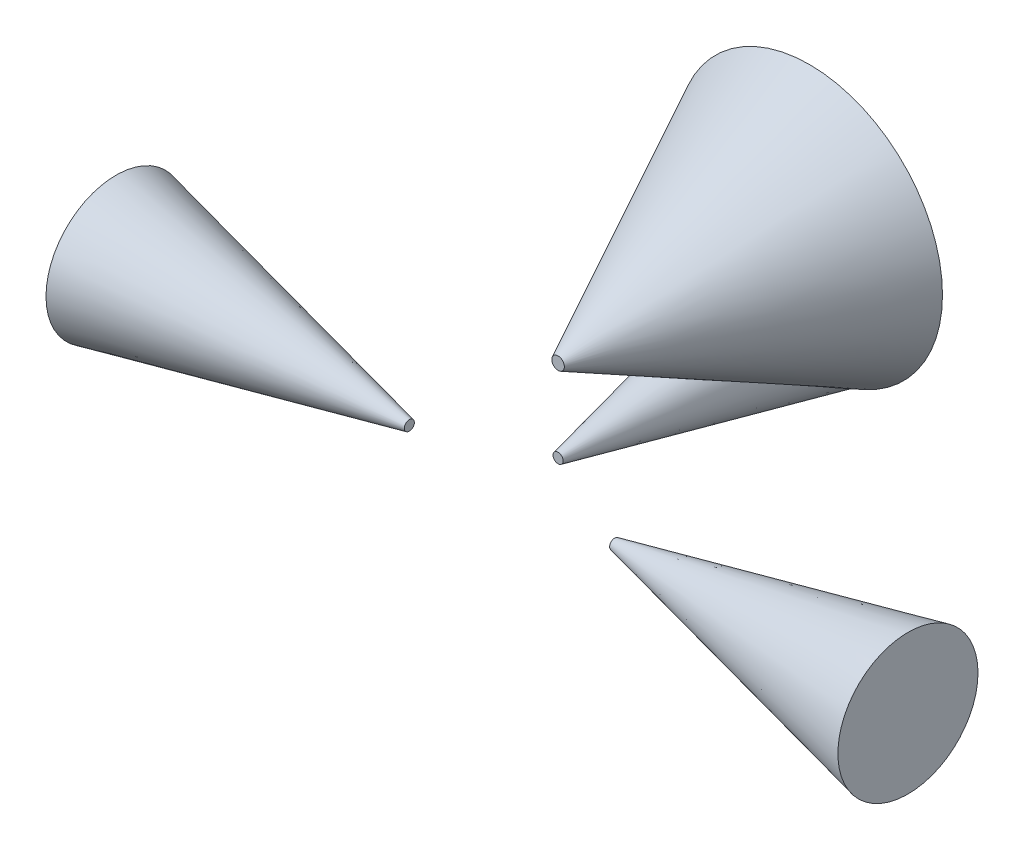
ISO-10303-21;
HEADER;
FILE_DESCRIPTION(('STEP AP214'),'2;1');
FILE_NAME('part.step','',(''),(''),'','','');
FILE_SCHEMA(('AUTOMOTIVE_DESIGN { 1 0 10303 214 1 1 1 1 }'));
ENDSEC;
DATA;
#1=APPLICATION_CONTEXT('core data for automotive mechanical design processes');
#2=APPLICATION_PROTOCOL_DEFINITION('international standard','automotive_design',2000,#1);
#3=PRODUCT_CONTEXT('',#1,'mechanical');
#4=PRODUCT('Part','Part','',(#3));
#5=PRODUCT_RELATED_PRODUCT_CATEGORY('part','',(#4));
#6=PRODUCT_DEFINITION_FORMATION('','',#4);
#7=PRODUCT_DEFINITION_CONTEXT('part definition',#1,'design');
#8=PRODUCT_DEFINITION('design','',#6,#7);
#9=PRODUCT_DEFINITION_SHAPE('','',#8);
#10=(LENGTH_UNIT() NAMED_UNIT(*) SI_UNIT(.MILLI.,.METRE.));
#11=(NAMED_UNIT(*) PLANE_ANGLE_UNIT() SI_UNIT($,.RADIAN.));
#12=(NAMED_UNIT(*) SI_UNIT($,.STERADIAN.) SOLID_ANGLE_UNIT());
#13=UNCERTAINTY_MEASURE_WITH_UNIT(LENGTH_MEASURE(1.E-05),#10,'distance_accuracy_value','');
#14=(GEOMETRIC_REPRESENTATION_CONTEXT(3) GLOBAL_UNCERTAINTY_ASSIGNED_CONTEXT((#13)) GLOBAL_UNIT_ASSIGNED_CONTEXT((#10,
#11,#12)) REPRESENTATION_CONTEXT('',''));
#15=CARTESIAN_POINT('',(0.,0.,0.));
#16=DIRECTION('',(0.,0.,1.));
#17=DIRECTION('',(1.,0.,0.));
#18=AXIS2_PLACEMENT_3D('',#15,#16,#17);
#19=CARTESIAN_POINT('',(0.,28.6,-43.));
#20=DIRECTION('',(0.,0.,-1.));
#21=DIRECTION('',(-1.,0.,0.));
#22=AXIS2_PLACEMENT_3D('',#19,#20,#21);
#23=CONICAL_SURFACE('',#22,1.5,0.466875574908483);
#24=CARTESIAN_POINT('',(0.,28.6,-103.));
#25=DIRECTION('',(0.,0.,-1.));
#26=DIRECTION('',(-1.,0.,0.));
#27=AXIS2_PLACEMENT_3D('',#24,#25,#26);
#28=CIRCLE('',#27,31.7424896594816);
#29=CARTESIAN_POINT('',(-31.7424896594816,28.6,-103.));
#30=VERTEX_POINT('',#29);
#31=EDGE_CURVE('E11',#30,#30,#28,.T.);
#32=CARTESIAN_POINT('',(0.,28.6,-43.));
#33=DIRECTION('',(0.,0.,-1.));
#34=DIRECTION('',(-1.,0.,0.));
#35=AXIS2_PLACEMENT_3D('',#32,#33,#34);
#36=CIRCLE('',#35,1.5);
#37=CARTESIAN_POINT('',(-1.5,28.6,-43.));
#38=VERTEX_POINT('',#37);
#39=EDGE_CURVE('E54',#38,#38,#36,.T.);
#40=CARTESIAN_POINT('',(-31.7424896594816,28.6,-103.));
#41=CARTESIAN_POINT('',(-31.4274637255287,28.6,-102.375));
#42=CARTESIAN_POINT('',(-31.1124377915757,28.6,-101.75));
#43=CARTESIAN_POINT('',(-30.4823859236698,28.6,-100.5));
#44=CARTESIAN_POINT('',(-30.1673599897169,28.6,-99.875));
#45=CARTESIAN_POINT('',(-29.537308121811,28.6,-98.625));
#46=CARTESIAN_POINT('',(-29.2222821878581,28.6,-98.));
#47=CARTESIAN_POINT('',(-28.5922303199523,28.6,-96.75));
#48=CARTESIAN_POINT('',(-28.2772043859993,28.6,-96.125));
#49=CARTESIAN_POINT('',(-27.6471525180935,28.6,-94.875));
#50=CARTESIAN_POINT('',(-27.3321265841405,28.6,-94.25));
#51=CARTESIAN_POINT('',(-26.7020747162347,28.6,-93.));
#52=CARTESIAN_POINT('',(-26.3870487822817,28.6,-92.375));
#53=CARTESIAN_POINT('',(-25.7569969143759,28.6,-91.125));
#54=CARTESIAN_POINT('',(-25.4419709804229,28.6,-90.5));
#55=CARTESIAN_POINT('',(-24.811919112517,28.6,-89.25));
#56=CARTESIAN_POINT('',(-24.4968931785641,28.6,-88.625));
#57=CARTESIAN_POINT('',(-23.8668413106583,28.6,-87.375));
#58=CARTESIAN_POINT('',(-23.5518153767053,28.6,-86.75));
#59=CARTESIAN_POINT('',(-22.9217635087995,28.6,-85.5));
#60=CARTESIAN_POINT('',(-22.6067375748465,28.6,-84.875));
#61=CARTESIAN_POINT('',(-21.9766857069407,28.6,-83.625));
#62=CARTESIAN_POINT('',(-21.6616597729877,28.6,-83.));
#63=CARTESIAN_POINT('',(-21.0316079050819,28.6,-81.75));
#64=CARTESIAN_POINT('',(-20.7165819711289,28.6,-81.125));
#65=CARTESIAN_POINT('',(-20.0865301032231,28.6,-79.875));
#66=CARTESIAN_POINT('',(-19.7715041692701,28.6,-79.25));
#67=CARTESIAN_POINT('',(-19.1414523013643,28.6,-78.));
#68=CARTESIAN_POINT('',(-18.8264263674113,28.6,-77.375));
#69=CARTESIAN_POINT('',(-18.1963744995055,28.6,-76.125));
#70=CARTESIAN_POINT('',(-17.8813485655525,28.6,-75.5));
#71=CARTESIAN_POINT('',(-17.2512966976467,28.6,-74.25));
#72=CARTESIAN_POINT('',(-16.9362707636937,28.6,-73.625));
#73=CARTESIAN_POINT('',(-16.3062188957879,28.6,-72.375));
#74=CARTESIAN_POINT('',(-15.9911929618349,28.6,-71.75));
#75=CARTESIAN_POINT('',(-15.3611410939291,28.6,-70.5));
#76=CARTESIAN_POINT('',(-15.0461151599761,28.6,-69.875));
#77=CARTESIAN_POINT('',(-14.4160632920703,28.6,-68.625));
#78=CARTESIAN_POINT('',(-14.1010373581173,28.6,-68.));
#79=CARTESIAN_POINT('',(-13.4709854902115,28.6,-66.75));
#80=CARTESIAN_POINT('',(-13.1559595562585,28.6,-66.125));
#81=CARTESIAN_POINT('',(-12.5259076883527,28.6,-64.875));
#82=CARTESIAN_POINT('',(-12.2108817543997,28.6,-64.25));
#83=CARTESIAN_POINT('',(-11.5808298864939,28.6,-63.));
#84=CARTESIAN_POINT('',(-11.2658039525409,28.6,-62.375));
#85=CARTESIAN_POINT('',(-10.6357520846351,28.6,-61.125));
#86=CARTESIAN_POINT('',(-10.3207261506821,28.6,-60.5));
#87=CARTESIAN_POINT('',(-9.69067428277626,28.6,-59.25));
#88=CARTESIAN_POINT('',(-9.37564834882333,28.6,-58.625));
#89=CARTESIAN_POINT('',(-8.74559648091746,28.6,-57.375));
#90=CARTESIAN_POINT('',(-8.43057054696453,28.6,-56.75));
#91=CARTESIAN_POINT('',(-7.80051867905866,28.6,-55.5));
#92=CARTESIAN_POINT('',(-7.48549274510573,28.6,-54.875));
#93=CARTESIAN_POINT('',(-6.85544087719986,28.6,-53.625));
#94=CARTESIAN_POINT('',(-6.54041494324693,28.6,-53.));
#95=CARTESIAN_POINT('',(-5.91036307534106,28.6,-51.75));
#96=CARTESIAN_POINT('',(-5.59533714138813,28.6,-51.125));
#97=CARTESIAN_POINT('',(-4.96528527348226,28.6,-49.875));
#98=CARTESIAN_POINT('',(-4.65025933952933,28.6,-49.25));
#99=CARTESIAN_POINT('',(-4.02020747162347,28.6,-48.));
#100=CARTESIAN_POINT('',(-3.70518153767053,28.6,-47.375));
#101=CARTESIAN_POINT('',(-3.07512966976467,28.6,-46.125));
#102=CARTESIAN_POINT('',(-2.76010373581173,28.6,-45.5));
#103=CARTESIAN_POINT('',(-2.13005186790587,28.6,-44.25));
#104=CARTESIAN_POINT('',(-1.81502593395293,28.6,-43.625));
#105=CARTESIAN_POINT('',(-1.5,28.6,-43.));
#106=B_SPLINE_CURVE_WITH_KNOTS('',3,(#40,#41,#42,#43,#44,#45,#46,#47,#48,#49,#50,#51,#52,#53,
#54,#55,#56,#57,#58,#59,#60,#61,#62,#63,#64,#65,#66,#67,#68,#69,#70,#71,#72,#73,#74,#75,#76,#77,
#78,#79,#80,#81,#82,#83,#84,#85,#86,#87,#88,#89,#90,#91,#92,#93,#94,#95,#96,#97,#98,#99,#100,
#101,#102,#103,#104,#105),.UNSPECIFIED.,.F.,.F.,(4,2,2,2,2,2,2,2,2,2,2,2,2,2,2,2,2,2,2,2,2,2,2,
2,2,2,2,2,2,2,2,2,4),(0.,2.09971356417163,4.19942712834323,6.29914069251484,8.39885425668646,
10.4985678208581,12.5982813850297,14.6979949492013,16.7977085133729,18.8974220775445,
20.9971356417161,23.0968492058877,25.1965627700594,27.296276334231,29.3959898984026,
31.4957034625742,33.5954170267458,35.6951305909174,37.794844155089,39.8945577192607,
41.9942712834323,44.0939848476039,46.1936984117755,48.2934119759471,50.3931255401187,
52.4928391042903,54.592552668462,56.6922662326336,58.7919797968052,60.8916933609768,
62.9914069251484,65.09112048932,67.1908340534916),.UNSPECIFIED.);
#107=EDGE_CURVE('BSEAM48',#30,#38,#106,.T.);
#108=ORIENTED_EDGE('',*,*,#31,.F.);
#109=ORIENTED_EDGE('',*,*,#39,.T.);
#110=ORIENTED_EDGE('',*,*,#107,.T.);
#111=ORIENTED_EDGE('',*,*,#107,.F.);
#112=EDGE_LOOP('',(#108,#110,#109,#111));
#113=FACE_BOUND('',#112,.T.);
#114=ADVANCED_FACE('F48',(#113),#23,.T.);
#115=CARTESIAN_POINT('',(0.,28.6,-103.));
#116=DIRECTION('',(0.,0.,-1.));
#117=DIRECTION('',(-1.,0.,0.));
#118=AXIS2_PLACEMENT_3D('',#115,#116,#117);
#119=PLANE('',#118);
#120=ORIENTED_EDGE('',*,*,#31,.T.);
#121=EDGE_LOOP('',(#120));
#122=FACE_BOUND('',#121,.T.);
#123=ADVANCED_FACE('F63',(#122),#119,.T.);
#124=CARTESIAN_POINT('',(0.,28.6,-43.));
#125=DIRECTION('',(0.,0.,-1.));
#126=DIRECTION('',(-1.,0.,0.));
#127=AXIS2_PLACEMENT_3D('',#124,#125,#126);
#128=PLANE('',#127);
#129=ORIENTED_EDGE('',*,*,#39,.F.);
#130=EDGE_LOOP('',(#129));
#131=FACE_BOUND('',#130,.T.);
#132=ADVANCED_FACE('F61',(#131),#128,.F.);
#133=CLOSED_SHELL('',(#114,#123,#132));
#134=MANIFOLD_SOLID_BREP('B2',#133);
#135=CARTESIAN_POINT('',(24.5,9.,-32.));
#136=DIRECTION('',(1.,0.,0.));
#137=DIRECTION('',(0.,0.,-1.));
#138=AXIS2_PLACEMENT_3D('',#135,#136,#137);
#139=CONICAL_SURFACE('',#138,1.2,0.218166156499291);
#140=CARTESIAN_POINT('',(94.5,9.,-32.));
#141=DIRECTION('',(1.,0.,0.));
#142=DIRECTION('',(0.,0.,-1.));
#143=AXIS2_PLACEMENT_3D('',#140,#141,#142);
#144=CIRCLE('',#143,16.7186263850058);
#145=CARTESIAN_POINT('',(94.5,9.,-48.7186263850058));
#146=VERTEX_POINT('',#145);
#147=EDGE_CURVE('E47',#146,#146,#144,.T.);
#148=CARTESIAN_POINT('',(24.5,9.,-32.));
#149=DIRECTION('',(1.,0.,0.));
#150=DIRECTION('',(0.,0.,-1.));
#151=AXIS2_PLACEMENT_3D('',#148,#149,#150);
#152=CIRCLE('',#151,1.2);
#153=CARTESIAN_POINT('',(24.5,9.,-33.2));
#154=VERTEX_POINT('',#153);
#155=EDGE_CURVE('E103',#154,#154,#152,.T.);
#156=CARTESIAN_POINT('',(94.5,9.,-48.7186263850058));
#157=CARTESIAN_POINT('',(93.7708333333333,9.,-48.5569740268286));
#158=CARTESIAN_POINT('',(93.0416666666666,9.,-48.3953216686515));
#159=CARTESIAN_POINT('',(91.5833333333333,9.,-48.0720169522972));
#160=CARTESIAN_POINT('',(90.8541666666667,9.,-47.9103645941201));
#161=CARTESIAN_POINT('',(89.3958333333333,9.,-47.5870598777658));
#162=CARTESIAN_POINT('',(88.6666666666666,9.,-47.4254075195886));
#163=CARTESIAN_POINT('',(87.2083333333333,9.,-47.1021028032344));
#164=CARTESIAN_POINT('',(86.4791666666666,9.,-46.9404504450572));
#165=CARTESIAN_POINT('',(85.0208333333333,9.,-46.6171457287029));
#166=CARTESIAN_POINT('',(84.2916666666667,9.,-46.4554933705258));
#167=CARTESIAN_POINT('',(82.8333333333333,9.,-46.1321886541715));
#168=CARTESIAN_POINT('',(82.1041666666666,9.,-45.9705362959943));
#169=CARTESIAN_POINT('',(80.6458333333333,9.,-45.6472315796401));
#170=CARTESIAN_POINT('',(79.9166666666666,9.,-45.4855792214629));
#171=CARTESIAN_POINT('',(78.4583333333333,9.,-45.1622745051086));
#172=CARTESIAN_POINT('',(77.7291666666667,9.,-45.0006221469315));
#173=CARTESIAN_POINT('',(76.2708333333333,9.,-44.6773174305772));
#174=CARTESIAN_POINT('',(75.5416666666666,9.,-44.5156650724001));
#175=CARTESIAN_POINT('',(74.0833333333333,9.,-44.1923603560458));
#176=CARTESIAN_POINT('',(73.3541666666667,9.,-44.0307079978686));
#177=CARTESIAN_POINT('',(71.8958333333333,9.,-43.7074032815143));
#178=CARTESIAN_POINT('',(71.1666666666667,9.,-43.5457509233372));
#179=CARTESIAN_POINT('',(69.7083333333333,9.,-43.2224462069829));
#180=CARTESIAN_POINT('',(68.9791666666666,9.,-43.0607938488058));
#181=CARTESIAN_POINT('',(67.5208333333333,9.,-42.7374891324515));
#182=CARTESIAN_POINT('',(66.7916666666667,9.,-42.5758367742743));
#183=CARTESIAN_POINT('',(65.3333333333333,9.,-42.25253205792));
#184=CARTESIAN_POINT('',(64.6041666666667,9.,-42.0908796997429));
#185=CARTESIAN_POINT('',(63.1458333333333,9.,-41.7675749833886));
#186=CARTESIAN_POINT('',(62.4166666666667,9.,-41.6059226252115));
#187=CARTESIAN_POINT('',(60.9583333333333,9.,-41.2826179088572));
#188=CARTESIAN_POINT('',(60.2291666666667,9.,-41.12096555068));
#189=CARTESIAN_POINT('',(58.7708333333333,9.,-40.7976608343257));
#190=CARTESIAN_POINT('',(58.0416666666667,9.,-40.6360084761486));
#191=CARTESIAN_POINT('',(56.5833333333333,9.,-40.3127037597943));
#192=CARTESIAN_POINT('',(55.8541666666667,9.,-40.1510514016172));
#193=CARTESIAN_POINT('',(54.3958333333333,9.,-39.8277466852629));
#194=CARTESIAN_POINT('',(53.6666666666667,9.,-39.6660943270857));
#195=CARTESIAN_POINT('',(52.2083333333333,9.,-39.3427896107315));
#196=CARTESIAN_POINT('',(51.4791666666667,9.,-39.1811372525543));
#197=CARTESIAN_POINT('',(50.0208333333333,9.,-38.8578325362));
#198=CARTESIAN_POINT('',(49.2916666666667,9.,-38.6961801780229));
#199=CARTESIAN_POINT('',(47.8333333333333,9.,-38.3728754616686));
#200=CARTESIAN_POINT('',(47.1041666666667,9.,-38.2112231034915));
#201=CARTESIAN_POINT('',(45.6458333333333,9.,-37.8879183871372));
#202=CARTESIAN_POINT('',(44.9166666666667,9.,-37.72626602896));
#203=CARTESIAN_POINT('',(43.4583333333333,9.,-37.4029613126057));
#204=CARTESIAN_POINT('',(42.7291666666667,9.,-37.2413089544286));
#205=CARTESIAN_POINT('',(41.2708333333333,9.,-36.9180042380743));
#206=CARTESIAN_POINT('',(40.5416666666667,9.,-36.7563518798972));
#207=CARTESIAN_POINT('',(39.0833333333333,9.,-36.4330471635429));
#208=CARTESIAN_POINT('',(38.3541666666667,9.,-36.2713948053657));
#209=CARTESIAN_POINT('',(36.8958333333333,9.,-35.9480900890114));
#210=CARTESIAN_POINT('',(36.1666666666667,9.,-35.7864377308343));
#211=CARTESIAN_POINT('',(34.7083333333333,9.,-35.46313301448));
#212=CARTESIAN_POINT('',(33.9791666666667,9.,-35.3014806563029));
#213=CARTESIAN_POINT('',(32.5208333333333,9.,-34.9781759399486));
#214=CARTESIAN_POINT('',(31.7916666666667,9.,-34.8165235817714));
#215=CARTESIAN_POINT('',(30.3333333333333,9.,-34.4932188654171));
#216=CARTESIAN_POINT('',(29.6041666666667,9.,-34.33156650724));
#217=CARTESIAN_POINT('',(28.1458333333333,9.,-34.0082617908857));
#218=CARTESIAN_POINT('',(27.4166666666667,9.,-33.8466094327086));
#219=CARTESIAN_POINT('',(25.9583333333333,9.,-33.5233047163543));
#220=CARTESIAN_POINT('',(25.2291666666667,9.,-33.3616523581771));
#221=CARTESIAN_POINT('',(24.5,9.,-33.2));
#222=B_SPLINE_CURVE_WITH_KNOTS('',3,(#156,#157,#158,#159,#160,#161,#162,#163,#164,#165,#166,
#167,#168,#169,#170,#171,#172,#173,#174,#175,#176,#177,#178,#179,#180,#181,#182,#183,#184,#185,
#186,#187,#188,#189,#190,#191,#192,#193,#194,#195,#196,#197,#198,#199,#200,#201,#202,#203,#204,
#205,#206,#207,#208,#209,#210,#211,#212,#213,#214,#215,#216,#217,#218,#219,#220,#221),
.UNSPECIFIED.,.F.,.F.,(4,2,2,2,2,2,2,2,2,2,2,2,2,2,2,2,2,2,2,2,2,2,2,2,2,2,2,2,2,2,2,2,4),(0.,
2.24061143756297,4.48122287512597,6.72183431268897,8.96244575025194,11.2030571878149,
13.4436686253779,15.6842800629409,17.9248915005039,20.1655029380669,22.4061143756299,
24.6467258131929,26.8873372507559,29.1279486883188,31.3685601258818,33.6091715634448,
35.8497830010078,38.0903944385708,40.3310058761338,42.5716173136968,44.8122287512597,
47.0528401888227,49.2934516263857,51.5340630639487,53.7746745015117,56.0152859390747,
58.2558973766377,60.4965088142007,62.7371202517636,64.9777316893266,67.2183431268896,
69.4589545644526,71.6995660020156),.UNSPECIFIED.);
#223=EDGE_CURVE('BSEAM97',#146,#154,#222,.T.);
#224=ORIENTED_EDGE('',*,*,#147,.F.);
#225=ORIENTED_EDGE('',*,*,#155,.T.);
#226=ORIENTED_EDGE('',*,*,#223,.T.);
#227=ORIENTED_EDGE('',*,*,#223,.F.);
#228=EDGE_LOOP('',(#224,#226,#225,#227));
#229=FACE_BOUND('',#228,.T.);
#230=ADVANCED_FACE('F97',(#229),#139,.T.);
#231=CARTESIAN_POINT('',(94.5,9.,-32.));
#232=DIRECTION('',(1.,0.,0.));
#233=DIRECTION('',(0.,0.,-1.));
#234=AXIS2_PLACEMENT_3D('',#231,#232,#233);
#235=PLANE('',#234);
#236=ORIENTED_EDGE('',*,*,#147,.T.);
#237=EDGE_LOOP('',(#236));
#238=FACE_BOUND('',#237,.T.);
#239=ADVANCED_FACE('F112',(#238),#235,.T.);
#240=CARTESIAN_POINT('',(24.5,9.,-32.));
#241=DIRECTION('',(1.,0.,0.));
#242=DIRECTION('',(0.,0.,-1.));
#243=AXIS2_PLACEMENT_3D('',#240,#241,#242);
#244=PLANE('',#243);
#245=ORIENTED_EDGE('',*,*,#155,.F.);
#246=EDGE_LOOP('',(#245));
#247=FACE_BOUND('',#246,.T.);
#248=ADVANCED_FACE('F110',(#247),#244,.F.);
#249=CLOSED_SHELL('',(#230,#239,#248));
#250=MANIFOLD_SOLID_BREP('B6',#249);
#251=CARTESIAN_POINT('',(0.,9.,-43.));
#252=DIRECTION('',(0.,0.,-1.));
#253=DIRECTION('',(-1.,0.,0.));
#254=AXIS2_PLACEMENT_3D('',#251,#252,#253);
#255=CONICAL_SURFACE('',#254,1.2,0.218166156499291);
#256=CARTESIAN_POINT('',(0.,9.,-113.));
#257=DIRECTION('',(0.,0.,-1.));
#258=DIRECTION('',(-1.,0.,0.));
#259=AXIS2_PLACEMENT_3D('',#256,#257,#258);
#260=CIRCLE('',#259,16.7186263850058);
#261=CARTESIAN_POINT('',(-16.7186263850058,9.,-113.));
#262=VERTEX_POINT('',#261);
#263=EDGE_CURVE('E96',#262,#262,#260,.T.);
#264=CARTESIAN_POINT('',(0.,9.,-43.));
#265=DIRECTION('',(0.,0.,-1.));
#266=DIRECTION('',(-1.,0.,0.));
#267=AXIS2_PLACEMENT_3D('',#264,#265,#266);
#268=CIRCLE('',#267,1.2);
#269=CARTESIAN_POINT('',(-1.2,9.,-43.));
#270=VERTEX_POINT('',#269);
#271=EDGE_CURVE('E151',#270,#270,#268,.T.);
#272=CARTESIAN_POINT('',(-16.7186263850058,9.,-113.));
#273=CARTESIAN_POINT('',(-16.5569740268286,9.,-112.270833333333));
#274=CARTESIAN_POINT('',(-16.3953216686515,9.,-111.541666666667));
#275=CARTESIAN_POINT('',(-16.0720169522972,9.,-110.083333333333));
#276=CARTESIAN_POINT('',(-15.9103645941201,9.,-109.354166666667));
#277=CARTESIAN_POINT('',(-15.5870598777658,9.,-107.895833333333));
#278=CARTESIAN_POINT('',(-15.4254075195886,9.,-107.166666666667));
#279=CARTESIAN_POINT('',(-15.1021028032344,9.,-105.708333333333));
#280=CARTESIAN_POINT('',(-14.9404504450572,9.,-104.979166666667));
#281=CARTESIAN_POINT('',(-14.6171457287029,9.,-103.520833333333));
#282=CARTESIAN_POINT('',(-14.4554933705258,9.,-102.791666666667));
#283=CARTESIAN_POINT('',(-14.1321886541715,9.,-101.333333333333));
#284=CARTESIAN_POINT('',(-13.9705362959944,9.,-100.604166666667));
#285=CARTESIAN_POINT('',(-13.6472315796401,9.,-99.1458333333333));
#286=CARTESIAN_POINT('',(-13.4855792214629,9.,-98.4166666666667));
#287=CARTESIAN_POINT('',(-13.1622745051086,9.,-96.9583333333333));
#288=CARTESIAN_POINT('',(-13.0006221469315,9.,-96.2291666666667));
#289=CARTESIAN_POINT('',(-12.6773174305772,9.,-94.7708333333333));
#290=CARTESIAN_POINT('',(-12.5156650724001,9.,-94.0416666666667));
#291=CARTESIAN_POINT('',(-12.1923603560458,9.,-92.5833333333333));
#292=CARTESIAN_POINT('',(-12.0307079978686,9.,-91.8541666666667));
#293=CARTESIAN_POINT('',(-11.7074032815143,9.,-90.3958333333333));
#294=CARTESIAN_POINT('',(-11.5457509233372,9.,-89.6666666666667));
#295=CARTESIAN_POINT('',(-11.2224462069829,9.,-88.2083333333333));
#296=CARTESIAN_POINT('',(-11.0607938488058,9.,-87.4791666666667));
#297=CARTESIAN_POINT('',(-10.7374891324515,9.,-86.0208333333333));
#298=CARTESIAN_POINT('',(-10.5758367742743,9.,-85.2916666666667));
#299=CARTESIAN_POINT('',(-10.25253205792,9.,-83.8333333333333));
#300=CARTESIAN_POINT('',(-10.0908796997429,9.,-83.1041666666667));
#301=CARTESIAN_POINT('',(-9.76757498338862,9.,-81.6458333333333));
#302=CARTESIAN_POINT('',(-9.60592262521147,9.,-80.9166666666667));
#303=CARTESIAN_POINT('',(-9.28261790885718,9.,-79.4583333333333));
#304=CARTESIAN_POINT('',(-9.12096555068004,9.,-78.7291666666667));
#305=CARTESIAN_POINT('',(-8.79766083432575,9.,-77.2708333333333));
#306=CARTESIAN_POINT('',(-8.63600847614861,9.,-76.5416666666667));
#307=CARTESIAN_POINT('',(-8.31270375979432,9.,-75.0833333333333));
#308=CARTESIAN_POINT('',(-8.15105140161718,9.,-74.3541666666667));
#309=CARTESIAN_POINT('',(-7.82774668526289,9.,-72.8958333333333));
#310=CARTESIAN_POINT('',(-7.66609432708575,9.,-72.1666666666667));
#311=CARTESIAN_POINT('',(-7.34278961073146,9.,-70.7083333333333));
#312=CARTESIAN_POINT('',(-7.18113725255432,9.,-69.9791666666667));
#313=CARTESIAN_POINT('',(-6.85783253620003,9.,-68.5208333333333));
#314=CARTESIAN_POINT('',(-6.69618017802289,9.,-67.7916666666667));
#315=CARTESIAN_POINT('',(-6.3728754616686,9.,-66.3333333333333));
#316=CARTESIAN_POINT('',(-6.21122310349145,9.,-65.6041666666667));
#317=CARTESIAN_POINT('',(-5.88791838713717,9.,-64.1458333333333));
#318=CARTESIAN_POINT('',(-5.72626602896002,9.,-63.4166666666667));
#319=CARTESIAN_POINT('',(-5.40296131260574,9.,-61.9583333333333));
#320=CARTESIAN_POINT('',(-5.24130895442859,9.,-61.2291666666667));
#321=CARTESIAN_POINT('',(-4.9180042380743,9.,-59.7708333333333));
#322=CARTESIAN_POINT('',(-4.75635187989716,9.,-59.0416666666667));
#323=CARTESIAN_POINT('',(-4.43304716354287,9.,-57.5833333333333));
#324=CARTESIAN_POINT('',(-4.27139480536573,9.,-56.8541666666667));
#325=CARTESIAN_POINT('',(-3.94809008901144,9.,-55.3958333333333));
#326=CARTESIAN_POINT('',(-3.7864377308343,9.,-54.6666666666667));
#327=CARTESIAN_POINT('',(-3.46313301448001,9.,-53.2083333333333));
#328=CARTESIAN_POINT('',(-3.30148065630287,9.,-52.4791666666667));
#329=CARTESIAN_POINT('',(-2.97817593994858,9.,-51.0208333333333));
#330=CARTESIAN_POINT('',(-2.81652358177144,9.,-50.2916666666667));
#331=CARTESIAN_POINT('',(-2.49321886541715,9.,-48.8333333333333));
#332=CARTESIAN_POINT('',(-2.33156650724001,9.,-48.1041666666667));
#333=CARTESIAN_POINT('',(-2.00826179088572,9.,-46.6458333333333));
#334=CARTESIAN_POINT('',(-1.84660943270857,9.,-45.9166666666667));
#335=CARTESIAN_POINT('',(-1.52330471635429,9.,-44.4583333333333));
#336=CARTESIAN_POINT('',(-1.36165235817714,9.,-43.7291666666667));
#337=CARTESIAN_POINT('',(-1.2,9.,-43.));
#338=B_SPLINE_CURVE_WITH_KNOTS('',3,(#272,#273,#274,#275,#276,#277,#278,#279,#280,#281,#282,
#283,#284,#285,#286,#287,#288,#289,#290,#291,#292,#293,#294,#295,#296,#297,#298,#299,#300,#301,
#302,#303,#304,#305,#306,#307,#308,#309,#310,#311,#312,#313,#314,#315,#316,#317,#318,#319,#320,
#321,#322,#323,#324,#325,#326,#327,#328,#329,#330,#331,#332,#333,#334,#335,#336,#337),
.UNSPECIFIED.,.F.,.F.,(4,2,2,2,2,2,2,2,2,2,2,2,2,2,2,2,2,2,2,2,2,2,2,2,2,2,2,2,2,2,2,2,4),(0.,
2.240611437563,4.481222875126,6.72183431268897,8.96244575025196,11.203057187815,
13.4436686253779,15.6842800629409,17.9248915005039,20.1655029380669,22.4061143756299,
24.6467258131929,26.8873372507559,29.1279486883189,31.3685601258818,33.6091715634448,
35.8497830010078,38.0903944385708,40.3310058761338,42.5716173136968,44.8122287512598,
47.0528401888228,49.2934516263857,51.5340630639487,53.7746745015117,56.0152859390747,
58.2558973766377,60.4965088142007,62.7371202517637,64.9777316893267,67.2183431268896,
69.4589545644527,71.6995660020156),.UNSPECIFIED.);
#339=EDGE_CURVE('BSEAM145',#262,#270,#338,.T.);
#340=ORIENTED_EDGE('',*,*,#263,.F.);
#341=ORIENTED_EDGE('',*,*,#271,.T.);
#342=ORIENTED_EDGE('',*,*,#339,.T.);
#343=ORIENTED_EDGE('',*,*,#339,.F.);
#344=EDGE_LOOP('',(#340,#342,#341,#343));
#345=FACE_BOUND('',#344,.T.);
#346=ADVANCED_FACE('F145',(#345),#255,.T.);
#347=CARTESIAN_POINT('',(0.,9.,-113.));
#348=DIRECTION('',(0.,0.,-1.));
#349=DIRECTION('',(-1.,0.,0.));
#350=AXIS2_PLACEMENT_3D('',#347,#348,#349);
#351=PLANE('',#350);
#352=ORIENTED_EDGE('',*,*,#263,.T.);
#353=EDGE_LOOP('',(#352));
#354=FACE_BOUND('',#353,.T.);
#355=ADVANCED_FACE('F160',(#354),#351,.T.);
#356=CARTESIAN_POINT('',(0.,9.,-43.));
#357=DIRECTION('',(0.,0.,-1.));
#358=DIRECTION('',(-1.,0.,0.));
#359=AXIS2_PLACEMENT_3D('',#356,#357,#358);
#360=PLANE('',#359);
#361=ORIENTED_EDGE('',*,*,#271,.F.);
#362=EDGE_LOOP('',(#361));
#363=FACE_BOUND('',#362,.T.);
#364=ADVANCED_FACE('F158',(#363),#360,.F.);
#365=CLOSED_SHELL('',(#346,#355,#364));
#366=MANIFOLD_SOLID_BREP('B42',#365);
#367=CARTESIAN_POINT('',(-24.5,9.,-32.));
#368=DIRECTION('',(-1.,0.,0.));
#369=DIRECTION('',(0.,0.,1.));
#370=AXIS2_PLACEMENT_3D('',#367,#368,#369);
#371=CONICAL_SURFACE('',#370,1.2,0.218166156499291);
#372=CARTESIAN_POINT('',(-94.5,9.,-32.));
#373=DIRECTION('',(-1.,0.,0.));
#374=DIRECTION('',(0.,0.,1.));
#375=AXIS2_PLACEMENT_3D('',#372,#373,#374);
#376=CIRCLE('',#375,16.7186263850058);
#377=CARTESIAN_POINT('',(-94.5,9.,-15.2813736149942));
#378=VERTEX_POINT('',#377);
#379=EDGE_CURVE('E144',#378,#378,#376,.T.);
#380=CARTESIAN_POINT('',(-24.5,9.,-32.));
#381=DIRECTION('',(-1.,0.,0.));
#382=DIRECTION('',(0.,0.,1.));
#383=AXIS2_PLACEMENT_3D('',#380,#381,#382);
#384=CIRCLE('',#383,1.2);
#385=CARTESIAN_POINT('',(-24.5,9.,-30.8));
#386=VERTEX_POINT('',#385);
#387=EDGE_CURVE('E192',#386,#386,#384,.T.);
#388=CARTESIAN_POINT('',(-94.5,9.,-15.2813736149942));
#389=CARTESIAN_POINT('',(-93.7708333333333,9.,-15.4430259731714));
#390=CARTESIAN_POINT('',(-93.0416666666666,9.,-15.6046783313485));
#391=CARTESIAN_POINT('',(-91.5833333333333,9.,-15.9279830477028));
#392=CARTESIAN_POINT('',(-90.8541666666667,9.,-16.0896354058799));
#393=CARTESIAN_POINT('',(-89.3958333333333,9.,-16.4129401222342));
#394=CARTESIAN_POINT('',(-88.6666666666666,9.,-16.5745924804114));
#395=CARTESIAN_POINT('',(-87.2083333333333,9.,-16.8978971967656));
#396=CARTESIAN_POINT('',(-86.4791666666666,9.,-17.0595495549428));
#397=CARTESIAN_POINT('',(-85.0208333333333,9.,-17.3828542712971));
#398=CARTESIAN_POINT('',(-84.2916666666667,9.,-17.5445066294742));
#399=CARTESIAN_POINT('',(-82.8333333333333,9.,-17.8678113458285));
#400=CARTESIAN_POINT('',(-82.1041666666666,9.,-18.0294637040057));
#401=CARTESIAN_POINT('',(-80.6458333333333,9.,-18.3527684203599));
#402=CARTESIAN_POINT('',(-79.9166666666666,9.,-18.5144207785371));
#403=CARTESIAN_POINT('',(-78.4583333333333,9.,-18.8377254948914));
#404=CARTESIAN_POINT('',(-77.7291666666667,9.,-18.9993778530685));
#405=CARTESIAN_POINT('',(-76.2708333333333,9.,-19.3226825694228));
#406=CARTESIAN_POINT('',(-75.5416666666666,9.,-19.4843349275999));
#407=CARTESIAN_POINT('',(-74.0833333333333,9.,-19.8076396439542));
#408=CARTESIAN_POINT('',(-73.3541666666667,9.,-19.9692920021314));
#409=CARTESIAN_POINT('',(-71.8958333333333,9.,-20.2925967184857));
#410=CARTESIAN_POINT('',(-71.1666666666667,9.,-20.4542490766628));
#411=CARTESIAN_POINT('',(-69.7083333333333,9.,-20.7775537930171));
#412=CARTESIAN_POINT('',(-68.9791666666666,9.,-20.9392061511942));
#413=CARTESIAN_POINT('',(-67.5208333333333,9.,-21.2625108675485));
#414=CARTESIAN_POINT('',(-66.7916666666667,9.,-21.4241632257257));
#415=CARTESIAN_POINT('',(-65.3333333333333,9.,-21.74746794208));
#416=CARTESIAN_POINT('',(-64.6041666666667,9.,-21.9091203002571));
#417=CARTESIAN_POINT('',(-63.1458333333333,9.,-22.2324250166114));
#418=CARTESIAN_POINT('',(-62.4166666666667,9.,-22.3940773747885));
#419=CARTESIAN_POINT('',(-60.9583333333333,9.,-22.7173820911428));
#420=CARTESIAN_POINT('',(-60.2291666666667,9.,-22.87903444932));
#421=CARTESIAN_POINT('',(-58.7708333333333,9.,-23.2023391656743));
#422=CARTESIAN_POINT('',(-58.0416666666667,9.,-23.3639915238514));
#423=CARTESIAN_POINT('',(-56.5833333333333,9.,-23.6872962402057));
#424=CARTESIAN_POINT('',(-55.8541666666667,9.,-23.8489485983828));
#425=CARTESIAN_POINT('',(-54.3958333333333,9.,-24.1722533147371));
#426=CARTESIAN_POINT('',(-53.6666666666667,9.,-24.3339056729143));
#427=CARTESIAN_POINT('',(-52.2083333333333,9.,-24.6572103892685));
#428=CARTESIAN_POINT('',(-51.4791666666667,9.,-24.8188627474457));
#429=CARTESIAN_POINT('',(-50.0208333333333,9.,-25.1421674638));
#430=CARTESIAN_POINT('',(-49.2916666666667,9.,-25.3038198219771));
#431=CARTESIAN_POINT('',(-47.8333333333333,9.,-25.6271245383314));
#432=CARTESIAN_POINT('',(-47.1041666666667,9.,-25.7887768965086));
#433=CARTESIAN_POINT('',(-45.6458333333333,9.,-26.1120816128628));
#434=CARTESIAN_POINT('',(-44.9166666666667,9.,-26.27373397104));
#435=CARTESIAN_POINT('',(-43.4583333333333,9.,-26.5970386873943));
#436=CARTESIAN_POINT('',(-42.7291666666667,9.,-26.7586910455714));
#437=CARTESIAN_POINT('',(-41.2708333333333,9.,-27.0819957619257));
#438=CARTESIAN_POINT('',(-40.5416666666667,9.,-27.2436481201028));
#439=CARTESIAN_POINT('',(-39.0833333333333,9.,-27.5669528364571));
#440=CARTESIAN_POINT('',(-38.3541666666667,9.,-27.7286051946343));
#441=CARTESIAN_POINT('',(-36.8958333333333,9.,-28.0519099109886));
#442=CARTESIAN_POINT('',(-36.1666666666667,9.,-28.2135622691657));
#443=CARTESIAN_POINT('',(-34.7083333333333,9.,-28.53686698552));
#444=CARTESIAN_POINT('',(-33.9791666666667,9.,-28.6985193436971));
#445=CARTESIAN_POINT('',(-32.5208333333333,9.,-29.0218240600514));
#446=CARTESIAN_POINT('',(-31.7916666666667,9.,-29.1834764182286));
#447=CARTESIAN_POINT('',(-30.3333333333333,9.,-29.5067811345829));
#448=CARTESIAN_POINT('',(-29.6041666666667,9.,-29.66843349276));
#449=CARTESIAN_POINT('',(-28.1458333333333,9.,-29.9917382091143));
#450=CARTESIAN_POINT('',(-27.4166666666667,9.,-30.1533905672914));
#451=CARTESIAN_POINT('',(-25.9583333333333,9.,-30.4766952836457));
#452=CARTESIAN_POINT('',(-25.2291666666667,9.,-30.6383476418229));
#453=CARTESIAN_POINT('',(-24.5,9.,-30.8));
#454=B_SPLINE_CURVE_WITH_KNOTS('',3,(#388,#389,#390,#391,#392,#393,#394,#395,#396,#397,#398,
#399,#400,#401,#402,#403,#404,#405,#406,#407,#408,#409,#410,#411,#412,#413,#414,#415,#416,#417,
#418,#419,#420,#421,#422,#423,#424,#425,#426,#427,#428,#429,#430,#431,#432,#433,#434,#435,#436,
#437,#438,#439,#440,#441,#442,#443,#444,#445,#446,#447,#448,#449,#450,#451,#452,#453),
.UNSPECIFIED.,.F.,.F.,(4,2,2,2,2,2,2,2,2,2,2,2,2,2,2,2,2,2,2,2,2,2,2,2,2,2,2,2,2,2,2,2,4),(0.,
2.24061143756297,4.48122287512597,6.72183431268897,8.96244575025194,11.2030571878149,
13.4436686253779,15.6842800629409,17.9248915005039,20.1655029380669,22.4061143756299,
24.6467258131929,26.8873372507559,29.1279486883188,31.3685601258818,33.6091715634448,
35.8497830010078,38.0903944385708,40.3310058761338,42.5716173136968,44.8122287512597,
47.0528401888227,49.2934516263857,51.5340630639487,53.7746745015117,56.0152859390747,
58.2558973766377,60.4965088142007,62.7371202517636,64.9777316893266,67.2183431268896,
69.4589545644526,71.6995660020156),.UNSPECIFIED.);
#455=EDGE_CURVE('BSEAM186',#378,#386,#454,.T.);
#456=ORIENTED_EDGE('',*,*,#379,.F.);
#457=ORIENTED_EDGE('',*,*,#387,.T.);
#458=ORIENTED_EDGE('',*,*,#455,.T.);
#459=ORIENTED_EDGE('',*,*,#455,.F.);
#460=EDGE_LOOP('',(#456,#458,#457,#459));
#461=FACE_BOUND('',#460,.T.);
#462=ADVANCED_FACE('F186',(#461),#371,.T.);
#463=CARTESIAN_POINT('',(-94.5,9.,-32.));
#464=DIRECTION('',(-1.,0.,0.));
#465=DIRECTION('',(0.,0.,1.));
#466=AXIS2_PLACEMENT_3D('',#463,#464,#465);
#467=PLANE('',#466);
#468=ORIENTED_EDGE('',*,*,#379,.T.);
#469=EDGE_LOOP('',(#468));
#470=FACE_BOUND('',#469,.T.);
#471=ADVANCED_FACE('F201',(#470),#467,.T.);
#472=CARTESIAN_POINT('',(-24.5,9.,-32.));
#473=DIRECTION('',(-1.,0.,0.));
#474=DIRECTION('',(0.,0.,1.));
#475=AXIS2_PLACEMENT_3D('',#472,#473,#474);
#476=PLANE('',#475);
#477=ORIENTED_EDGE('',*,*,#387,.F.);
#478=EDGE_LOOP('',(#477));
#479=FACE_BOUND('',#478,.T.);
#480=ADVANCED_FACE('F199',(#479),#476,.F.);
#481=CLOSED_SHELL('',(#462,#471,#480));
#482=MANIFOLD_SOLID_BREP('B91',#481);
#483=ADVANCED_BREP_SHAPE_REPRESENTATION('',(#18,#134,#250,#366,#482),#14);
#484=SHAPE_DEFINITION_REPRESENTATION(#9,#483);
ENDSEC;
END-ISO-10303-21;
